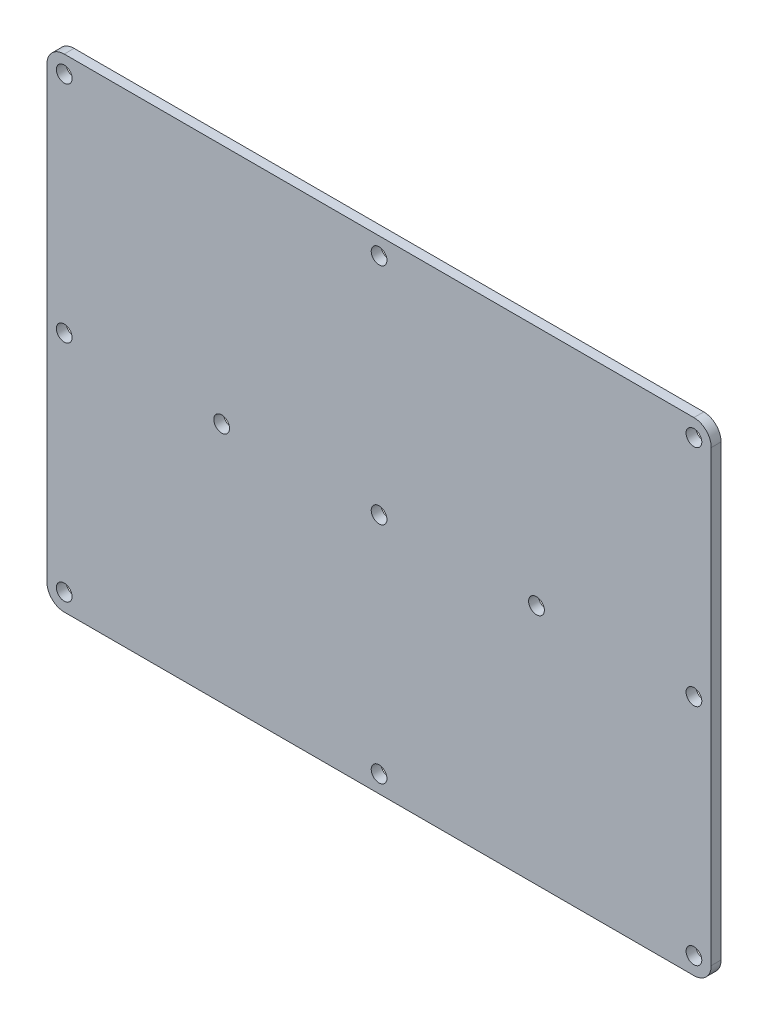
ISO-10303-21;
HEADER;
FILE_DESCRIPTION(('STEP AP214'),'2;1');
FILE_NAME('part.step','',(''),(''),'','','');
FILE_SCHEMA(('AUTOMOTIVE_DESIGN { 1 0 10303 214 1 1 1 1 }'));
ENDSEC;
DATA;
#1=APPLICATION_CONTEXT('core data for automotive mechanical design processes');
#2=APPLICATION_PROTOCOL_DEFINITION('international standard','automotive_design',2000,#1);
#3=PRODUCT_CONTEXT('',#1,'mechanical');
#4=PRODUCT('Part','Part','',(#3));
#5=PRODUCT_RELATED_PRODUCT_CATEGORY('part','',(#4));
#6=PRODUCT_DEFINITION_FORMATION('','',#4);
#7=PRODUCT_DEFINITION_CONTEXT('part definition',#1,'design');
#8=PRODUCT_DEFINITION('design','',#6,#7);
#9=PRODUCT_DEFINITION_SHAPE('','',#8);
#10=(LENGTH_UNIT() NAMED_UNIT(*) SI_UNIT(.MILLI.,.METRE.));
#11=(NAMED_UNIT(*) PLANE_ANGLE_UNIT() SI_UNIT($,.RADIAN.));
#12=(NAMED_UNIT(*) SI_UNIT($,.STERADIAN.) SOLID_ANGLE_UNIT());
#13=UNCERTAINTY_MEASURE_WITH_UNIT(LENGTH_MEASURE(1.E-05),#10,'distance_accuracy_value','');
#14=(GEOMETRIC_REPRESENTATION_CONTEXT(3) GLOBAL_UNCERTAINTY_ASSIGNED_CONTEXT((#13)) GLOBAL_UNIT_ASSIGNED_CONTEXT((#10,
#11,#12)) REPRESENTATION_CONTEXT('',''));
#15=CARTESIAN_POINT('',(0.,0.,0.));
#16=DIRECTION('',(0.,0.,1.));
#17=DIRECTION('',(1.,0.,0.));
#18=AXIS2_PLACEMENT_3D('',#15,#16,#17);
#19=CARTESIAN_POINT('',(0.,77.9780000000002,3.175));
#20=DIRECTION('',(0.,1.,0.));
#21=DIRECTION('',(0.,0.,1.));
#22=AXIS2_PLACEMENT_3D('',#19,#20,#21);
#23=PLANE('',#22);
#24=DIRECTION('',(1.,0.,0.));
#25=VECTOR('',#24,1.);
#26=CARTESIAN_POINT('',(0.,77.9780000000002,0.));
#27=LINE('',#26,#25);
#28=CARTESIAN_POINT('',(-101.6,77.9780000000002,0.));
#29=VERTEX_POINT('',#28);
#30=CARTESIAN_POINT('',(101.6,77.9780000000002,0.));
#31=VERTEX_POINT('',#30);
#32=EDGE_CURVE('E164',#29,#31,#27,.T.);
#33=ORIENTED_EDGE('',*,*,#32,.F.);
#34=DIRECTION('',(0.,0.,-1.));
#35=VECTOR('',#34,1.);
#36=CARTESIAN_POINT('',(-101.6,77.9780000000002,3.175));
#37=LINE('',#36,#35);
#38=CARTESIAN_POINT('',(-101.6,77.9780000000002,3.175));
#39=VERTEX_POINT('',#38);
#40=EDGE_CURVE('E11',#39,#29,#37,.T.);
#41=ORIENTED_EDGE('',*,*,#40,.F.);
#42=DIRECTION('',(1.,0.,0.));
#43=VECTOR('',#42,1.);
#44=CARTESIAN_POINT('',(0.,77.9780000000002,3.175));
#45=LINE('',#44,#43);
#46=CARTESIAN_POINT('',(101.6,77.9780000000002,3.175));
#47=VERTEX_POINT('',#46);
#48=EDGE_CURVE('E452',#39,#47,#45,.T.);
#49=ORIENTED_EDGE('',*,*,#48,.T.);
#50=DIRECTION('',(0.,0.,-1.));
#51=VECTOR('',#50,1.);
#52=CARTESIAN_POINT('',(101.6,77.9780000000002,3.175));
#53=LINE('',#52,#51);
#54=EDGE_CURVE('E54',#47,#31,#53,.T.);
#55=ORIENTED_EDGE('',*,*,#54,.T.);
#56=EDGE_LOOP('',(#33,#41,#49,#55));
#57=FACE_BOUND('',#56,.T.);
#58=ADVANCED_FACE('F37',(#57),#23,.T.);
#59=CARTESIAN_POINT('',(-101.6,72.3900000000002,3.175));
#60=DIRECTION('',(0.,0.,-1.));
#61=DIRECTION('',(-1.,0.,0.));
#62=AXIS2_PLACEMENT_3D('',#59,#60,#61);
#63=CYLINDRICAL_SURFACE('',#62,5.588);
#64=CARTESIAN_POINT('',(-101.6,72.3900000000002,0.));
#65=DIRECTION('',(0.,0.,1.));
#66=DIRECTION('',(1.,0.,0.));
#67=AXIS2_PLACEMENT_3D('',#64,#65,#66);
#68=CIRCLE('',#67,5.588);
#69=CARTESIAN_POINT('',(-107.188,72.3900000000001,0.));
#70=VERTEX_POINT('',#69);
#71=EDGE_CURVE('E166',#29,#70,#68,.T.);
#72=ORIENTED_EDGE('',*,*,#71,.T.);
#73=DIRECTION('',(0.,0.,-1.));
#74=VECTOR('',#73,1.);
#75=CARTESIAN_POINT('',(-107.188,72.3900000000001,3.175));
#76=LINE('',#75,#74);
#77=CARTESIAN_POINT('',(-107.188,72.3900000000001,3.175));
#78=VERTEX_POINT('',#77);
#79=EDGE_CURVE('E46',#78,#70,#76,.T.);
#80=ORIENTED_EDGE('',*,*,#79,.F.);
#81=CARTESIAN_POINT('',(-101.6,72.3900000000002,3.175));
#82=DIRECTION('',(0.,0.,1.));
#83=DIRECTION('',(1.,0.,0.));
#84=AXIS2_PLACEMENT_3D('',#81,#82,#83);
#85=CIRCLE('',#84,5.588);
#86=EDGE_CURVE('E448',#39,#78,#85,.T.);
#87=ORIENTED_EDGE('',*,*,#86,.F.);
#88=ORIENTED_EDGE('',*,*,#40,.T.);
#89=EDGE_LOOP('',(#72,#80,#87,#88));
#90=FACE_BOUND('',#89,.T.);
#91=ADVANCED_FACE('F203',(#90),#63,.T.);
#92=CARTESIAN_POINT('',(-107.188,0.,3.175));
#93=DIRECTION('',(1.,0.,0.));
#94=DIRECTION('',(0.,1.,0.));
#95=AXIS2_PLACEMENT_3D('',#92,#93,#94);
#96=PLANE('',#95);
#97=DIRECTION('',(0.,-1.,0.));
#98=VECTOR('',#97,1.);
#99=CARTESIAN_POINT('',(-107.188,0.,0.));
#100=LINE('',#99,#98);
#101=CARTESIAN_POINT('',(-107.188,-72.3900000000003,0.));
#102=VERTEX_POINT('',#101);
#103=EDGE_CURVE('E169',#70,#102,#100,.T.);
#104=ORIENTED_EDGE('',*,*,#103,.T.);
#105=DIRECTION('',(0.,0.,-1.));
#106=VECTOR('',#105,1.);
#107=CARTESIAN_POINT('',(-107.188,-72.3900000000003,3.175));
#108=LINE('',#107,#106);
#109=CARTESIAN_POINT('',(-107.188,-72.3900000000003,3.175));
#110=VERTEX_POINT('',#109);
#111=EDGE_CURVE('E191',#110,#102,#108,.T.);
#112=ORIENTED_EDGE('',*,*,#111,.F.);
#113=DIRECTION('',(0.,-1.,0.));
#114=VECTOR('',#113,1.);
#115=CARTESIAN_POINT('',(-107.188,0.,3.175));
#116=LINE('',#115,#114);
#117=EDGE_CURVE('E199',#78,#110,#116,.T.);
#118=ORIENTED_EDGE('',*,*,#117,.F.);
#119=ORIENTED_EDGE('',*,*,#79,.T.);
#120=EDGE_LOOP('',(#104,#112,#118,#119));
#121=FACE_BOUND('',#120,.T.);
#122=ADVANCED_FACE('F196',(#121),#96,.F.);
#123=CARTESIAN_POINT('',(-101.6,-72.3900000000003,3.175));
#124=DIRECTION('',(0.,0.,-1.));
#125=DIRECTION('',(-1.,0.,0.));
#126=AXIS2_PLACEMENT_3D('',#123,#124,#125);
#127=CYLINDRICAL_SURFACE('',#126,5.58800000000001);
#128=CARTESIAN_POINT('',(-101.6,-72.3900000000003,0.));
#129=DIRECTION('',(0.,0.,1.));
#130=DIRECTION('',(1.,0.,0.));
#131=AXIS2_PLACEMENT_3D('',#128,#129,#130);
#132=CIRCLE('',#131,5.58800000000001);
#133=CARTESIAN_POINT('',(-101.6,-77.9780000000003,0.));
#134=VERTEX_POINT('',#133);
#135=EDGE_CURVE('E172',#102,#134,#132,.T.);
#136=ORIENTED_EDGE('',*,*,#135,.T.);
#137=DIRECTION('',(0.,0.,-1.));
#138=VECTOR('',#137,1.);
#139=CARTESIAN_POINT('',(-101.6,-77.9780000000003,3.175));
#140=LINE('',#139,#138);
#141=CARTESIAN_POINT('',(-101.6,-77.9780000000003,3.175));
#142=VERTEX_POINT('',#141);
#143=EDGE_CURVE('E188',#142,#134,#140,.T.);
#144=ORIENTED_EDGE('',*,*,#143,.F.);
#145=CARTESIAN_POINT('',(-101.6,-72.3900000000003,3.175));
#146=DIRECTION('',(0.,0.,1.));
#147=DIRECTION('',(1.,0.,0.));
#148=AXIS2_PLACEMENT_3D('',#145,#146,#147);
#149=CIRCLE('',#148,5.58800000000001);
#150=EDGE_CURVE('E446',#110,#142,#149,.T.);
#151=ORIENTED_EDGE('',*,*,#150,.F.);
#152=ORIENTED_EDGE('',*,*,#111,.T.);
#153=EDGE_LOOP('',(#136,#144,#151,#152));
#154=FACE_BOUND('',#153,.T.);
#155=ADVANCED_FACE('F308',(#154),#127,.T.);
#156=CARTESIAN_POINT('',(0.,-77.9780000000003,3.175));
#157=DIRECTION('',(0.,1.,0.));
#158=DIRECTION('',(0.,0.,1.));
#159=AXIS2_PLACEMENT_3D('',#156,#157,#158);
#160=PLANE('',#159);
#161=DIRECTION('',(1.,0.,0.));
#162=VECTOR('',#161,1.);
#163=CARTESIAN_POINT('',(0.,-77.9780000000003,0.));
#164=LINE('',#163,#162);
#165=CARTESIAN_POINT('',(101.6,-77.9780000000003,0.));
#166=VERTEX_POINT('',#165);
#167=EDGE_CURVE('E175',#134,#166,#164,.T.);
#168=ORIENTED_EDGE('',*,*,#167,.T.);
#169=DIRECTION('',(0.,0.,-1.));
#170=VECTOR('',#169,1.);
#171=CARTESIAN_POINT('',(101.6,-77.9780000000003,3.175));
#172=LINE('',#171,#170);
#173=CARTESIAN_POINT('',(101.6,-77.9780000000003,3.175));
#174=VERTEX_POINT('',#173);
#175=EDGE_CURVE('E123',#174,#166,#172,.T.);
#176=ORIENTED_EDGE('',*,*,#175,.F.);
#177=DIRECTION('',(1.,0.,0.));
#178=VECTOR('',#177,1.);
#179=CARTESIAN_POINT('',(0.,-77.9780000000003,3.175));
#180=LINE('',#179,#178);
#181=EDGE_CURVE('E112',#142,#174,#180,.T.);
#182=ORIENTED_EDGE('',*,*,#181,.F.);
#183=ORIENTED_EDGE('',*,*,#143,.T.);
#184=EDGE_LOOP('',(#168,#176,#182,#183));
#185=FACE_BOUND('',#184,.T.);
#186=ADVANCED_FACE('F305',(#185),#160,.F.);
#187=CARTESIAN_POINT('',(101.6,-72.3900000000003,3.175));
#188=DIRECTION('',(0.,0.,-1.));
#189=DIRECTION('',(-1.,0.,0.));
#190=AXIS2_PLACEMENT_3D('',#187,#188,#189);
#191=CYLINDRICAL_SURFACE('',#190,5.58799999999999);
#192=CARTESIAN_POINT('',(101.6,-72.3900000000003,0.));
#193=DIRECTION('',(0.,0.,1.));
#194=DIRECTION('',(1.,0.,0.));
#195=AXIS2_PLACEMENT_3D('',#192,#193,#194);
#196=CIRCLE('',#195,5.58799999999999);
#197=CARTESIAN_POINT('',(107.188,-72.3900000000002,0.));
#198=VERTEX_POINT('',#197);
#199=EDGE_CURVE('E120',#166,#198,#196,.T.);
#200=ORIENTED_EDGE('',*,*,#199,.T.);
#201=DIRECTION('',(0.,0.,-1.));
#202=VECTOR('',#201,1.);
#203=CARTESIAN_POINT('',(107.188,-72.3900000000002,3.175));
#204=LINE('',#203,#202);
#205=CARTESIAN_POINT('',(107.188,-72.3900000000002,3.175));
#206=VERTEX_POINT('',#205);
#207=EDGE_CURVE('E118',#206,#198,#204,.T.);
#208=ORIENTED_EDGE('',*,*,#207,.F.);
#209=CARTESIAN_POINT('',(101.6,-72.3900000000003,3.175));
#210=DIRECTION('',(0.,0.,1.));
#211=DIRECTION('',(1.,0.,0.));
#212=AXIS2_PLACEMENT_3D('',#209,#210,#211);
#213=CIRCLE('',#212,5.58799999999999);
#214=EDGE_CURVE('E104',#174,#206,#213,.T.);
#215=ORIENTED_EDGE('',*,*,#214,.F.);
#216=ORIENTED_EDGE('',*,*,#175,.T.);
#217=EDGE_LOOP('',(#200,#208,#215,#216));
#218=FACE_BOUND('',#217,.T.);
#219=ADVANCED_FACE('F119',(#218),#191,.T.);
#220=CARTESIAN_POINT('',(107.188,0.,3.175));
#221=DIRECTION('',(1.,0.,0.));
#222=DIRECTION('',(0.,0.,-1.));
#223=AXIS2_PLACEMENT_3D('',#220,#221,#222);
#224=PLANE('',#223);
#225=DIRECTION('',(0.,-1.,0.));
#226=VECTOR('',#225,1.);
#227=CARTESIAN_POINT('',(107.188,0.,0.));
#228=LINE('',#227,#226);
#229=CARTESIAN_POINT('',(107.188,72.3900000000003,0.));
#230=VERTEX_POINT('',#229);
#231=EDGE_CURVE('E179',#230,#198,#228,.T.);
#232=ORIENTED_EDGE('',*,*,#231,.F.);
#233=DIRECTION('',(0.,0.,-1.));
#234=VECTOR('',#233,1.);
#235=CARTESIAN_POINT('',(107.188,72.3900000000003,3.175));
#236=LINE('',#235,#234);
#237=CARTESIAN_POINT('',(107.188,72.3900000000003,3.175));
#238=VERTEX_POINT('',#237);
#239=EDGE_CURVE('E79',#238,#230,#236,.T.);
#240=ORIENTED_EDGE('',*,*,#239,.F.);
#241=DIRECTION('',(0.,-1.,0.));
#242=VECTOR('',#241,1.);
#243=CARTESIAN_POINT('',(107.188,0.,3.175));
#244=LINE('',#243,#242);
#245=EDGE_CURVE('E110',#238,#206,#244,.T.);
#246=ORIENTED_EDGE('',*,*,#245,.T.);
#247=ORIENTED_EDGE('',*,*,#207,.T.);
#248=EDGE_LOOP('',(#232,#240,#246,#247));
#249=FACE_BOUND('',#248,.T.);
#250=ADVANCED_FACE('F125',(#249),#224,.T.);
#251=CARTESIAN_POINT('',(101.6,-72.39,3.175));
#252=DIRECTION('',(0.,0.,-1.));
#253=DIRECTION('',(-1.,0.,0.));
#254=AXIS2_PLACEMENT_3D('',#251,#252,#253);
#255=CYLINDRICAL_SURFACE('',#254,2.53999999999999);
#256=CARTESIAN_POINT('',(101.6,-72.39,3.175));
#257=DIRECTION('',(0.,0.,1.));
#258=DIRECTION('',(1.,0.,0.));
#259=AXIS2_PLACEMENT_3D('',#256,#257,#258);
#260=CIRCLE('',#259,2.53999999999999);
#261=CARTESIAN_POINT('',(104.14,-72.39,3.175));
#262=VERTEX_POINT('',#261);
#263=EDGE_CURVE('E454',#262,#262,#260,.T.);
#264=ORIENTED_EDGE('',*,*,#263,.T.);
#265=EDGE_LOOP('',(#264));
#266=FACE_BOUND('',#265,.T.);
#267=CARTESIAN_POINT('',(101.6,-72.39,0.));
#268=DIRECTION('',(0.,0.,1.));
#269=DIRECTION('',(1.,0.,0.));
#270=AXIS2_PLACEMENT_3D('',#267,#268,#269);
#271=CIRCLE('',#270,2.53999999999999);
#272=CARTESIAN_POINT('',(104.14,-72.39,0.));
#273=VERTEX_POINT('',#272);
#274=EDGE_CURVE('E161',#273,#273,#271,.T.);
#275=ORIENTED_EDGE('',*,*,#274,.F.);
#276=EDGE_LOOP('',(#275));
#277=FACE_BOUND('',#276,.T.);
#278=ADVANCED_FACE('F214',(#266,#277),#255,.F.);
#279=CARTESIAN_POINT('',(0.,-72.39,3.175));
#280=DIRECTION('',(0.,0.,-1.));
#281=DIRECTION('',(-1.,0.,0.));
#282=AXIS2_PLACEMENT_3D('',#279,#280,#281);
#283=CYLINDRICAL_SURFACE('',#282,2.54);
#284=CARTESIAN_POINT('',(0.,-72.39,3.175));
#285=DIRECTION('',(0.,0.,1.));
#286=DIRECTION('',(1.,0.,0.));
#287=AXIS2_PLACEMENT_3D('',#284,#285,#286);
#288=CIRCLE('',#287,2.54);
#289=CARTESIAN_POINT('',(2.54000000000003,-72.39,3.175));
#290=VERTEX_POINT('',#289);
#291=EDGE_CURVE('E457',#290,#290,#288,.T.);
#292=ORIENTED_EDGE('',*,*,#291,.T.);
#293=EDGE_LOOP('',(#292));
#294=FACE_BOUND('',#293,.T.);
#295=CARTESIAN_POINT('',(0.,-72.39,0.));
#296=DIRECTION('',(0.,0.,1.));
#297=DIRECTION('',(1.,0.,0.));
#298=AXIS2_PLACEMENT_3D('',#295,#296,#297);
#299=CIRCLE('',#298,2.54);
#300=CARTESIAN_POINT('',(2.54000000000003,-72.39,0.));
#301=VERTEX_POINT('',#300);
#302=EDGE_CURVE('E158',#301,#301,#299,.T.);
#303=ORIENTED_EDGE('',*,*,#302,.F.);
#304=EDGE_LOOP('',(#303));
#305=FACE_BOUND('',#304,.T.);
#306=ADVANCED_FACE('F217',(#294,#305),#283,.F.);
#307=CARTESIAN_POINT('',(-101.6,-72.39,3.175));
#308=DIRECTION('',(0.,0.,-1.));
#309=DIRECTION('',(-1.,0.,0.));
#310=AXIS2_PLACEMENT_3D('',#307,#308,#309);
#311=CYLINDRICAL_SURFACE('',#310,2.53999999999999);
#312=CARTESIAN_POINT('',(-101.6,-72.39,3.175));
#313=DIRECTION('',(0.,0.,1.));
#314=DIRECTION('',(1.,0.,0.));
#315=AXIS2_PLACEMENT_3D('',#312,#313,#314);
#316=CIRCLE('',#315,2.53999999999999);
#317=CARTESIAN_POINT('',(-99.0599999999997,-72.39,3.175));
#318=VERTEX_POINT('',#317);
#319=EDGE_CURVE('E460',#318,#318,#316,.T.);
#320=ORIENTED_EDGE('',*,*,#319,.T.);
#321=EDGE_LOOP('',(#320));
#322=FACE_BOUND('',#321,.T.);
#323=CARTESIAN_POINT('',(-101.6,-72.39,0.));
#324=DIRECTION('',(0.,0.,1.));
#325=DIRECTION('',(1.,0.,0.));
#326=AXIS2_PLACEMENT_3D('',#323,#324,#325);
#327=CIRCLE('',#326,2.53999999999999);
#328=CARTESIAN_POINT('',(-99.0599999999997,-72.39,0.));
#329=VERTEX_POINT('',#328);
#330=EDGE_CURVE('E155',#329,#329,#327,.T.);
#331=ORIENTED_EDGE('',*,*,#330,.F.);
#332=EDGE_LOOP('',(#331));
#333=FACE_BOUND('',#332,.T.);
#334=ADVANCED_FACE('F221',(#322,#333),#311,.F.);
#335=CARTESIAN_POINT('',(101.6,72.39,3.175));
#336=DIRECTION('',(0.,0.,-1.));
#337=DIRECTION('',(-1.,0.,0.));
#338=AXIS2_PLACEMENT_3D('',#335,#336,#337);
#339=CYLINDRICAL_SURFACE('',#338,2.53999999999999);
#340=CARTESIAN_POINT('',(101.6,72.39,3.175));
#341=DIRECTION('',(0.,0.,1.));
#342=DIRECTION('',(1.,0.,0.));
#343=AXIS2_PLACEMENT_3D('',#340,#341,#342);
#344=CIRCLE('',#343,2.53999999999999);
#345=CARTESIAN_POINT('',(104.14,72.39,3.175));
#346=VERTEX_POINT('',#345);
#347=EDGE_CURVE('E463',#346,#346,#344,.T.);
#348=ORIENTED_EDGE('',*,*,#347,.T.);
#349=EDGE_LOOP('',(#348));
#350=FACE_BOUND('',#349,.T.);
#351=CARTESIAN_POINT('',(101.6,72.39,0.));
#352=DIRECTION('',(0.,0.,1.));
#353=DIRECTION('',(1.,0.,0.));
#354=AXIS2_PLACEMENT_3D('',#351,#352,#353);
#355=CIRCLE('',#354,2.53999999999999);
#356=CARTESIAN_POINT('',(104.14,72.39,0.));
#357=VERTEX_POINT('',#356);
#358=EDGE_CURVE('E152',#357,#357,#355,.T.);
#359=ORIENTED_EDGE('',*,*,#358,.F.);
#360=EDGE_LOOP('',(#359));
#361=FACE_BOUND('',#360,.T.);
#362=ADVANCED_FACE('F225',(#350,#361),#339,.F.);
#363=CARTESIAN_POINT('',(0.,72.39,3.175));
#364=DIRECTION('',(0.,0.,-1.));
#365=DIRECTION('',(-1.,0.,0.));
#366=AXIS2_PLACEMENT_3D('',#363,#364,#365);
#367=CYLINDRICAL_SURFACE('',#366,2.54);
#368=CARTESIAN_POINT('',(0.,72.39,3.175));
#369=DIRECTION('',(0.,0.,1.));
#370=DIRECTION('',(1.,0.,0.));
#371=AXIS2_PLACEMENT_3D('',#368,#369,#370);
#372=CIRCLE('',#371,2.54);
#373=CARTESIAN_POINT('',(2.54,72.39,3.175));
#374=VERTEX_POINT('',#373);
#375=EDGE_CURVE('E466',#374,#374,#372,.T.);
#376=ORIENTED_EDGE('',*,*,#375,.T.);
#377=EDGE_LOOP('',(#376));
#378=FACE_BOUND('',#377,.T.);
#379=CARTESIAN_POINT('',(0.,72.39,0.));
#380=DIRECTION('',(0.,0.,1.));
#381=DIRECTION('',(1.,0.,0.));
#382=AXIS2_PLACEMENT_3D('',#379,#380,#381);
#383=CIRCLE('',#382,2.54);
#384=CARTESIAN_POINT('',(2.54,72.39,0.));
#385=VERTEX_POINT('',#384);
#386=EDGE_CURVE('E149',#385,#385,#383,.T.);
#387=ORIENTED_EDGE('',*,*,#386,.F.);
#388=EDGE_LOOP('',(#387));
#389=FACE_BOUND('',#388,.T.);
#390=ADVANCED_FACE('F229',(#378,#389),#367,.F.);
#391=CARTESIAN_POINT('',(-101.6,72.39,3.175));
#392=DIRECTION('',(0.,0.,-1.));
#393=DIRECTION('',(-1.,0.,0.));
#394=AXIS2_PLACEMENT_3D('',#391,#392,#393);
#395=CYLINDRICAL_SURFACE('',#394,2.53999999999999);
#396=CARTESIAN_POINT('',(-101.6,72.39,3.175));
#397=DIRECTION('',(0.,0.,1.));
#398=DIRECTION('',(1.,0.,0.));
#399=AXIS2_PLACEMENT_3D('',#396,#397,#398);
#400=CIRCLE('',#399,2.53999999999999);
#401=CARTESIAN_POINT('',(-99.0599999999997,72.39,3.175));
#402=VERTEX_POINT('',#401);
#403=EDGE_CURVE('E469',#402,#402,#400,.T.);
#404=ORIENTED_EDGE('',*,*,#403,.T.);
#405=EDGE_LOOP('',(#404));
#406=FACE_BOUND('',#405,.T.);
#407=CARTESIAN_POINT('',(-101.6,72.39,0.));
#408=DIRECTION('',(0.,0.,1.));
#409=DIRECTION('',(1.,0.,0.));
#410=AXIS2_PLACEMENT_3D('',#407,#408,#409);
#411=CIRCLE('',#410,2.53999999999999);
#412=CARTESIAN_POINT('',(-99.0599999999997,72.39,0.));
#413=VERTEX_POINT('',#412);
#414=EDGE_CURVE('E146',#413,#413,#411,.T.);
#415=ORIENTED_EDGE('',*,*,#414,.F.);
#416=EDGE_LOOP('',(#415));
#417=FACE_BOUND('',#416,.T.);
#418=ADVANCED_FACE('F233',(#406,#417),#395,.F.);
#419=CARTESIAN_POINT('',(50.7999999999999,0.,3.175));
#420=DIRECTION('',(0.,0.,-1.));
#421=DIRECTION('',(-1.,0.,0.));
#422=AXIS2_PLACEMENT_3D('',#419,#420,#421);
#423=CYLINDRICAL_SURFACE('',#422,2.54);
#424=CARTESIAN_POINT('',(50.7999999999999,0.,3.175));
#425=DIRECTION('',(0.,0.,1.));
#426=DIRECTION('',(1.,0.,0.));
#427=AXIS2_PLACEMENT_3D('',#424,#425,#426);
#428=CIRCLE('',#427,2.54);
#429=CARTESIAN_POINT('',(53.3399999999999,0.,3.175));
#430=VERTEX_POINT('',#429);
#431=EDGE_CURVE('E472',#430,#430,#428,.T.);
#432=ORIENTED_EDGE('',*,*,#431,.T.);
#433=EDGE_LOOP('',(#432));
#434=FACE_BOUND('',#433,.T.);
#435=CARTESIAN_POINT('',(50.7999999999999,0.,0.));
#436=DIRECTION('',(0.,0.,1.));
#437=DIRECTION('',(1.,0.,0.));
#438=AXIS2_PLACEMENT_3D('',#435,#436,#437);
#439=CIRCLE('',#438,2.54);
#440=CARTESIAN_POINT('',(53.3399999999999,0.,0.));
#441=VERTEX_POINT('',#440);
#442=EDGE_CURVE('E143',#441,#441,#439,.T.);
#443=ORIENTED_EDGE('',*,*,#442,.F.);
#444=EDGE_LOOP('',(#443));
#445=FACE_BOUND('',#444,.T.);
#446=ADVANCED_FACE('F237',(#434,#445),#423,.F.);
#447=CARTESIAN_POINT('',(101.600000000001,0.,3.175));
#448=DIRECTION('',(0.,0.,-1.));
#449=DIRECTION('',(-1.,0.,0.));
#450=AXIS2_PLACEMENT_3D('',#447,#448,#449);
#451=CYLINDRICAL_SURFACE('',#450,2.54);
#452=CARTESIAN_POINT('',(101.600000000001,0.,3.175));
#453=DIRECTION('',(0.,0.,1.));
#454=DIRECTION('',(1.,0.,0.));
#455=AXIS2_PLACEMENT_3D('',#452,#453,#454);
#456=CIRCLE('',#455,2.54);
#457=CARTESIAN_POINT('',(104.140000000001,0.,3.175));
#458=VERTEX_POINT('',#457);
#459=EDGE_CURVE('E475',#458,#458,#456,.T.);
#460=ORIENTED_EDGE('',*,*,#459,.T.);
#461=EDGE_LOOP('',(#460));
#462=FACE_BOUND('',#461,.T.);
#463=CARTESIAN_POINT('',(101.600000000001,0.,0.));
#464=DIRECTION('',(0.,0.,1.));
#465=DIRECTION('',(1.,0.,0.));
#466=AXIS2_PLACEMENT_3D('',#463,#464,#465);
#467=CIRCLE('',#466,2.54);
#468=CARTESIAN_POINT('',(104.140000000001,0.,0.));
#469=VERTEX_POINT('',#468);
#470=EDGE_CURVE('E140',#469,#469,#467,.T.);
#471=ORIENTED_EDGE('',*,*,#470,.F.);
#472=EDGE_LOOP('',(#471));
#473=FACE_BOUND('',#472,.T.);
#474=ADVANCED_FACE('F241',(#462,#473),#451,.F.);
#475=CARTESIAN_POINT('',(0.,0.,3.175));
#476=DIRECTION('',(0.,0.,-1.));
#477=DIRECTION('',(-1.,0.,0.));
#478=AXIS2_PLACEMENT_3D('',#475,#476,#477);
#479=CYLINDRICAL_SURFACE('',#478,2.54);
#480=CARTESIAN_POINT('',(0.,0.,3.175));
#481=DIRECTION('',(0.,0.,1.));
#482=DIRECTION('',(1.,0.,0.));
#483=AXIS2_PLACEMENT_3D('',#480,#481,#482);
#484=CIRCLE('',#483,2.54);
#485=CARTESIAN_POINT('',(2.54,0.,3.175));
#486=VERTEX_POINT('',#485);
#487=EDGE_CURVE('E478',#486,#486,#484,.T.);
#488=ORIENTED_EDGE('',*,*,#487,.T.);
#489=EDGE_LOOP('',(#488));
#490=FACE_BOUND('',#489,.T.);
#491=CARTESIAN_POINT('',(0.,0.,0.));
#492=DIRECTION('',(0.,0.,1.));
#493=DIRECTION('',(1.,0.,0.));
#494=AXIS2_PLACEMENT_3D('',#491,#492,#493);
#495=CIRCLE('',#494,2.54);
#496=CARTESIAN_POINT('',(2.54,0.,0.));
#497=VERTEX_POINT('',#496);
#498=EDGE_CURVE('E137',#497,#497,#495,.T.);
#499=ORIENTED_EDGE('',*,*,#498,.F.);
#500=EDGE_LOOP('',(#499));
#501=FACE_BOUND('',#500,.T.);
#502=ADVANCED_FACE('F245',(#490,#501),#479,.F.);
#503=CARTESIAN_POINT('',(-50.7999999999997,0.,3.175));
#504=DIRECTION('',(0.,0.,-1.));
#505=DIRECTION('',(-1.,0.,0.));
#506=AXIS2_PLACEMENT_3D('',#503,#504,#505);
#507=CYLINDRICAL_SURFACE('',#506,2.54);
#508=CARTESIAN_POINT('',(-50.7999999999997,0.,3.175));
#509=DIRECTION('',(0.,0.,1.));
#510=DIRECTION('',(1.,0.,0.));
#511=AXIS2_PLACEMENT_3D('',#508,#509,#510);
#512=CIRCLE('',#511,2.54);
#513=CARTESIAN_POINT('',(-48.2599999999997,0.,3.175));
#514=VERTEX_POINT('',#513);
#515=EDGE_CURVE('E260',#514,#514,#512,.T.);
#516=ORIENTED_EDGE('',*,*,#515,.T.);
#517=EDGE_LOOP('',(#516));
#518=FACE_BOUND('',#517,.T.);
#519=CARTESIAN_POINT('',(-50.7999999999997,0.,0.));
#520=DIRECTION('',(0.,0.,1.));
#521=DIRECTION('',(1.,0.,0.));
#522=AXIS2_PLACEMENT_3D('',#519,#520,#521);
#523=CIRCLE('',#522,2.54);
#524=CARTESIAN_POINT('',(-48.2599999999997,0.,0.));
#525=VERTEX_POINT('',#524);
#526=EDGE_CURVE('E134',#525,#525,#523,.T.);
#527=ORIENTED_EDGE('',*,*,#526,.F.);
#528=EDGE_LOOP('',(#527));
#529=FACE_BOUND('',#528,.T.);
#530=ADVANCED_FACE('F248',(#518,#529),#507,.F.);
#531=CARTESIAN_POINT('',(-101.6,0.,3.175));
#532=DIRECTION('',(0.,0.,-1.));
#533=DIRECTION('',(-1.,0.,0.));
#534=AXIS2_PLACEMENT_3D('',#531,#532,#533);
#535=CYLINDRICAL_SURFACE('',#534,2.54);
#536=CARTESIAN_POINT('',(-101.6,0.,3.175));
#537=DIRECTION('',(0.,0.,1.));
#538=DIRECTION('',(1.,0.,0.));
#539=AXIS2_PLACEMENT_3D('',#536,#537,#538);
#540=CIRCLE('',#539,2.54);
#541=CARTESIAN_POINT('',(-99.0599999999997,0.,3.175));
#542=VERTEX_POINT('',#541);
#543=EDGE_CURVE('E184',#542,#542,#540,.T.);
#544=ORIENTED_EDGE('',*,*,#543,.T.);
#545=EDGE_LOOP('',(#544));
#546=FACE_BOUND('',#545,.T.);
#547=CARTESIAN_POINT('',(-101.6,0.,0.));
#548=DIRECTION('',(0.,0.,1.));
#549=DIRECTION('',(1.,0.,0.));
#550=AXIS2_PLACEMENT_3D('',#547,#548,#549);
#551=CIRCLE('',#550,2.54);
#552=CARTESIAN_POINT('',(-99.0599999999997,0.,0.));
#553=VERTEX_POINT('',#552);
#554=EDGE_CURVE('E131',#553,#553,#551,.T.);
#555=ORIENTED_EDGE('',*,*,#554,.F.);
#556=EDGE_LOOP('',(#555));
#557=FACE_BOUND('',#556,.T.);
#558=ADVANCED_FACE('F39',(#546,#557),#535,.F.);
#559=CARTESIAN_POINT('',(101.6,72.3900000000003,3.175));
#560=DIRECTION('',(0.,0.,-1.));
#561=DIRECTION('',(-1.,0.,0.));
#562=AXIS2_PLACEMENT_3D('',#559,#560,#561);
#563=CYLINDRICAL_SURFACE('',#562,5.58799999999998);
#564=CARTESIAN_POINT('',(101.6,72.3900000000003,0.));
#565=DIRECTION('',(0.,0.,1.));
#566=DIRECTION('',(1.,0.,0.));
#567=AXIS2_PLACEMENT_3D('',#564,#565,#566);
#568=CIRCLE('',#567,5.58799999999998);
#569=EDGE_CURVE('E181',#31,#230,#568,.F.);
#570=ORIENTED_EDGE('',*,*,#569,.F.);
#571=ORIENTED_EDGE('',*,*,#54,.F.);
#572=CARTESIAN_POINT('',(101.6,72.3900000000003,3.175));
#573=DIRECTION('',(0.,0.,1.));
#574=DIRECTION('',(1.,0.,0.));
#575=AXIS2_PLACEMENT_3D('',#572,#573,#574);
#576=CIRCLE('',#575,5.58799999999998);
#577=EDGE_CURVE('E126',#47,#238,#576,.F.);
#578=ORIENTED_EDGE('',*,*,#577,.T.);
#579=ORIENTED_EDGE('',*,*,#239,.T.);
#580=EDGE_LOOP('',(#570,#571,#578,#579));
#581=FACE_BOUND('',#580,.T.);
#582=ADVANCED_FACE('F255',(#581),#563,.T.);
#583=CARTESIAN_POINT('',(0.,0.,3.175));
#584=DIRECTION('',(0.,0.,1.));
#585=DIRECTION('',(1.,0.,0.));
#586=AXIS2_PLACEMENT_3D('',#583,#584,#585);
#587=PLANE('',#586);
#588=ORIENTED_EDGE('',*,*,#543,.F.);
#589=EDGE_LOOP('',(#588));
#590=FACE_BOUND('',#589,.T.);
#591=ORIENTED_EDGE('',*,*,#515,.F.);
#592=EDGE_LOOP('',(#591));
#593=FACE_BOUND('',#592,.T.);
#594=ORIENTED_EDGE('',*,*,#487,.F.);
#595=EDGE_LOOP('',(#594));
#596=FACE_BOUND('',#595,.T.);
#597=ORIENTED_EDGE('',*,*,#459,.F.);
#598=EDGE_LOOP('',(#597));
#599=FACE_BOUND('',#598,.T.);
#600=ORIENTED_EDGE('',*,*,#431,.F.);
#601=EDGE_LOOP('',(#600));
#602=FACE_BOUND('',#601,.T.);
#603=ORIENTED_EDGE('',*,*,#403,.F.);
#604=EDGE_LOOP('',(#603));
#605=FACE_BOUND('',#604,.T.);
#606=ORIENTED_EDGE('',*,*,#375,.F.);
#607=EDGE_LOOP('',(#606));
#608=FACE_BOUND('',#607,.T.);
#609=ORIENTED_EDGE('',*,*,#347,.F.);
#610=EDGE_LOOP('',(#609));
#611=FACE_BOUND('',#610,.T.);
#612=ORIENTED_EDGE('',*,*,#319,.F.);
#613=EDGE_LOOP('',(#612));
#614=FACE_BOUND('',#613,.T.);
#615=ORIENTED_EDGE('',*,*,#291,.F.);
#616=EDGE_LOOP('',(#615));
#617=FACE_BOUND('',#616,.T.);
#618=ORIENTED_EDGE('',*,*,#263,.F.);
#619=EDGE_LOOP('',(#618));
#620=FACE_BOUND('',#619,.T.);
#621=ORIENTED_EDGE('',*,*,#48,.F.);
#622=ORIENTED_EDGE('',*,*,#86,.T.);
#623=ORIENTED_EDGE('',*,*,#117,.T.);
#624=ORIENTED_EDGE('',*,*,#150,.T.);
#625=ORIENTED_EDGE('',*,*,#181,.T.);
#626=ORIENTED_EDGE('',*,*,#214,.T.);
#627=ORIENTED_EDGE('',*,*,#245,.F.);
#628=ORIENTED_EDGE('',*,*,#577,.F.);
#629=EDGE_LOOP('',(#621,#622,#623,#624,#625,#626,#627,#628));
#630=FACE_BOUND('',#629,.T.);
#631=ADVANCED_FACE('F107',(#590,#593,#596,#599,#602,#605,#608,#611,#614,#617,#620,#630),#587,.T.);
#632=CARTESIAN_POINT('',(0.,0.,0.));
#633=DIRECTION('',(0.,0.,1.));
#634=DIRECTION('',(1.,0.,0.));
#635=AXIS2_PLACEMENT_3D('',#632,#633,#634);
#636=PLANE('',#635);
#637=ORIENTED_EDGE('',*,*,#554,.T.);
#638=EDGE_LOOP('',(#637));
#639=FACE_BOUND('',#638,.T.);
#640=ORIENTED_EDGE('',*,*,#526,.T.);
#641=EDGE_LOOP('',(#640));
#642=FACE_BOUND('',#641,.T.);
#643=ORIENTED_EDGE('',*,*,#498,.T.);
#644=EDGE_LOOP('',(#643));
#645=FACE_BOUND('',#644,.T.);
#646=ORIENTED_EDGE('',*,*,#470,.T.);
#647=EDGE_LOOP('',(#646));
#648=FACE_BOUND('',#647,.T.);
#649=ORIENTED_EDGE('',*,*,#442,.T.);
#650=EDGE_LOOP('',(#649));
#651=FACE_BOUND('',#650,.T.);
#652=ORIENTED_EDGE('',*,*,#414,.T.);
#653=EDGE_LOOP('',(#652));
#654=FACE_BOUND('',#653,.T.);
#655=ORIENTED_EDGE('',*,*,#386,.T.);
#656=EDGE_LOOP('',(#655));
#657=FACE_BOUND('',#656,.T.);
#658=ORIENTED_EDGE('',*,*,#358,.T.);
#659=EDGE_LOOP('',(#658));
#660=FACE_BOUND('',#659,.T.);
#661=ORIENTED_EDGE('',*,*,#330,.T.);
#662=EDGE_LOOP('',(#661));
#663=FACE_BOUND('',#662,.T.);
#664=ORIENTED_EDGE('',*,*,#302,.T.);
#665=EDGE_LOOP('',(#664));
#666=FACE_BOUND('',#665,.T.);
#667=ORIENTED_EDGE('',*,*,#274,.T.);
#668=EDGE_LOOP('',(#667));
#669=FACE_BOUND('',#668,.T.);
#670=ORIENTED_EDGE('',*,*,#32,.T.);
#671=ORIENTED_EDGE('',*,*,#569,.T.);
#672=ORIENTED_EDGE('',*,*,#231,.T.);
#673=ORIENTED_EDGE('',*,*,#199,.F.);
#674=ORIENTED_EDGE('',*,*,#167,.F.);
#675=ORIENTED_EDGE('',*,*,#135,.F.);
#676=ORIENTED_EDGE('',*,*,#103,.F.);
#677=ORIENTED_EDGE('',*,*,#71,.F.);
#678=EDGE_LOOP('',(#670,#671,#672,#673,#674,#675,#676,#677));
#679=FACE_BOUND('',#678,.T.);
#680=ADVANCED_FACE('F205',(#639,#642,#645,#648,#651,#654,#657,#660,#663,#666,#669,#679),#636,.F.);
#681=CLOSED_SHELL('',(#58,#91,#122,#155,#186,#219,#250,#278,#306,#334,#362,#390,#418,#446,#474,
#502,#530,#558,#582,#631,#680));
#682=MANIFOLD_SOLID_BREP('B2',#681);
#683=ADVANCED_BREP_SHAPE_REPRESENTATION('',(#18,#682),#14);
#684=SHAPE_DEFINITION_REPRESENTATION(#9,#683);
ENDSEC;
END-ISO-10303-21;
